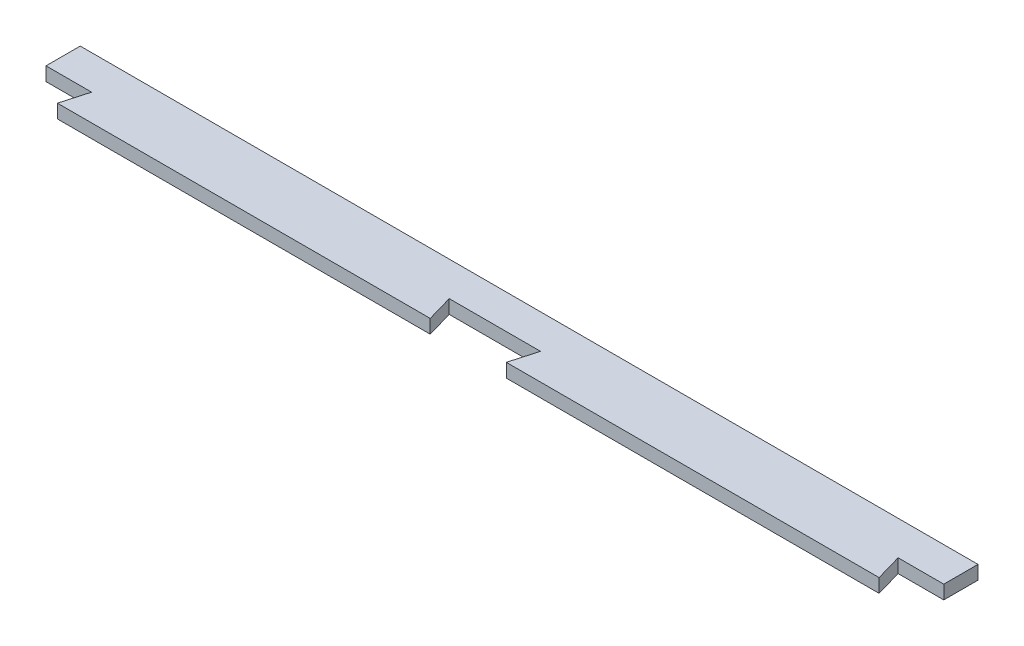
ISO-10303-21;
HEADER;
FILE_DESCRIPTION(('STEP AP214'),'2;1');
FILE_NAME('part.step','',(''),(''),'','','');
FILE_SCHEMA(('AUTOMOTIVE_DESIGN { 1 0 10303 214 1 1 1 1 }'));
ENDSEC;
DATA;
#1=APPLICATION_CONTEXT('core data for automotive mechanical design processes');
#2=APPLICATION_PROTOCOL_DEFINITION('international standard','automotive_design',2000,#1);
#3=PRODUCT_CONTEXT('',#1,'mechanical');
#4=PRODUCT('Part','Part','',(#3));
#5=PRODUCT_RELATED_PRODUCT_CATEGORY('part','',(#4));
#6=PRODUCT_DEFINITION_FORMATION('','',#4);
#7=PRODUCT_DEFINITION_CONTEXT('part definition',#1,'design');
#8=PRODUCT_DEFINITION('design','',#6,#7);
#9=PRODUCT_DEFINITION_SHAPE('','',#8);
#10=(LENGTH_UNIT() NAMED_UNIT(*) SI_UNIT(.MILLI.,.METRE.));
#11=(NAMED_UNIT(*) PLANE_ANGLE_UNIT() SI_UNIT($,.RADIAN.));
#12=(NAMED_UNIT(*) SI_UNIT($,.STERADIAN.) SOLID_ANGLE_UNIT());
#13=UNCERTAINTY_MEASURE_WITH_UNIT(LENGTH_MEASURE(1.E-05),#10,'distance_accuracy_value','');
#14=(GEOMETRIC_REPRESENTATION_CONTEXT(3) GLOBAL_UNCERTAINTY_ASSIGNED_CONTEXT((#13)) GLOBAL_UNIT_ASSIGNED_CONTEXT((#10,
#11,#12)) REPRESENTATION_CONTEXT('',''));
#15=CARTESIAN_POINT('',(0.,0.,0.));
#16=DIRECTION('',(0.,0.,1.));
#17=DIRECTION('',(1.,0.,0.));
#18=AXIS2_PLACEMENT_3D('',#15,#16,#17);
#19=CARTESIAN_POINT('',(0.,9.00000000000001,-17.5));
#20=DIRECTION('',(0.,0.,1.));
#21=DIRECTION('',(1.,0.,0.));
#22=AXIS2_PLACEMENT_3D('',#19,#20,#21);
#23=PLANE('',#22);
#24=DIRECTION('',(-1.,0.,0.));
#25=VECTOR('',#24,1.);
#26=CARTESIAN_POINT('',(0.,0.,-17.5));
#27=LINE('',#26,#25);
#28=CARTESIAN_POINT('',(590.,0.,-17.5000000000001));
#29=VERTEX_POINT('',#28);
#30=CARTESIAN_POINT('',(560.,0.,-17.5000000000001));
#31=VERTEX_POINT('',#30);
#32=EDGE_CURVE('E166',#29,#31,#27,.T.);
#33=ORIENTED_EDGE('',*,*,#32,.F.);
#34=DIRECTION('',(0.,-1.,0.));
#35=VECTOR('',#34,1.);
#36=CARTESIAN_POINT('',(590.,9.00000000000001,-17.5000000000001));
#37=LINE('',#36,#35);
#38=CARTESIAN_POINT('',(590.,9.00000000000001,-17.5000000000001));
#39=VERTEX_POINT('',#38);
#40=EDGE_CURVE('E11',#39,#29,#37,.T.);
#41=ORIENTED_EDGE('',*,*,#40,.F.);
#42=DIRECTION('',(-1.,0.,0.));
#43=VECTOR('',#42,1.);
#44=CARTESIAN_POINT('',(0.,9.00000000000001,-17.5));
#45=LINE('',#44,#43);
#46=CARTESIAN_POINT('',(560.,9.00000000000001,-17.5000000000001));
#47=VERTEX_POINT('',#46);
#48=EDGE_CURVE('E208',#39,#47,#45,.T.);
#49=ORIENTED_EDGE('',*,*,#48,.T.);
#50=DIRECTION('',(0.,-1.,0.));
#51=VECTOR('',#50,1.);
#52=CARTESIAN_POINT('',(560.,9.00000000000001,-17.5000000000001));
#53=LINE('',#52,#51);
#54=EDGE_CURVE('E59',#47,#31,#53,.T.);
#55=ORIENTED_EDGE('',*,*,#54,.T.);
#56=EDGE_LOOP('',(#33,#41,#49,#55));
#57=FACE_BOUND('',#56,.T.);
#58=ADVANCED_FACE('F42',(#57),#23,.T.);
#59=CARTESIAN_POINT('',(590.,9.00000000000001,0.));
#60=DIRECTION('',(-1.,0.,0.));
#61=DIRECTION('',(0.,0.,1.));
#62=AXIS2_PLACEMENT_3D('',#59,#60,#61);
#63=PLANE('',#62);
#64=DIRECTION('',(0.,0.,-1.));
#65=VECTOR('',#64,1.);
#66=CARTESIAN_POINT('',(590.,0.,0.));
#67=LINE('',#66,#65);
#68=CARTESIAN_POINT('',(590.,0.,-39.9999999999999));
#69=VERTEX_POINT('',#68);
#70=EDGE_CURVE('E169',#29,#69,#67,.T.);
#71=ORIENTED_EDGE('',*,*,#70,.T.);
#72=DIRECTION('',(0.,-1.,0.));
#73=VECTOR('',#72,1.);
#74=CARTESIAN_POINT('',(590.,9.00000000000001,-39.9999999999999));
#75=LINE('',#74,#73);
#76=CARTESIAN_POINT('',(590.,9.00000000000001,-39.9999999999999));
#77=VERTEX_POINT('',#76);
#78=EDGE_CURVE('E51',#77,#69,#75,.T.);
#79=ORIENTED_EDGE('',*,*,#78,.F.);
#80=DIRECTION('',(0.,0.,-1.));
#81=VECTOR('',#80,1.);
#82=CARTESIAN_POINT('',(590.,9.00000000000001,0.));
#83=LINE('',#82,#81);
#84=EDGE_CURVE('E257',#39,#77,#83,.T.);
#85=ORIENTED_EDGE('',*,*,#84,.F.);
#86=ORIENTED_EDGE('',*,*,#40,.T.);
#87=EDGE_LOOP('',(#71,#79,#85,#86));
#88=FACE_BOUND('',#87,.T.);
#89=ADVANCED_FACE('F245',(#88),#63,.F.);
#90=CARTESIAN_POINT('',(0.,9.00000000000001,-39.9999999999999));
#91=DIRECTION('',(0.,0.,-1.));
#92=DIRECTION('',(-1.,0.,0.));
#93=AXIS2_PLACEMENT_3D('',#90,#91,#92);
#94=PLANE('',#93);
#95=DIRECTION('',(1.,0.,0.));
#96=VECTOR('',#95,1.);
#97=CARTESIAN_POINT('',(0.,0.,-39.9999999999999));
#98=LINE('',#97,#96);
#99=CARTESIAN_POINT('',(0.,0.,-39.9999999999999));
#100=VERTEX_POINT('',#99);
#101=EDGE_CURVE('E173',#100,#69,#98,.T.);
#102=ORIENTED_EDGE('',*,*,#101,.F.);
#103=DIRECTION('',(0.,-1.,0.));
#104=VECTOR('',#103,1.);
#105=CARTESIAN_POINT('',(0.,9.00000000000001,-39.9999999999999));
#106=LINE('',#105,#104);
#107=CARTESIAN_POINT('',(0.,9.00000000000001,-39.9999999999999));
#108=VERTEX_POINT('',#107);
#109=EDGE_CURVE('E232',#108,#100,#106,.T.);
#110=ORIENTED_EDGE('',*,*,#109,.F.);
#111=DIRECTION('',(1.,0.,0.));
#112=VECTOR('',#111,1.);
#113=CARTESIAN_POINT('',(0.,9.00000000000001,-39.9999999999999));
#114=LINE('',#113,#112);
#115=EDGE_CURVE('E242',#108,#77,#114,.T.);
#116=ORIENTED_EDGE('',*,*,#115,.T.);
#117=ORIENTED_EDGE('',*,*,#78,.T.);
#118=EDGE_LOOP('',(#102,#110,#116,#117));
#119=FACE_BOUND('',#118,.T.);
#120=ADVANCED_FACE('F240',(#119),#94,.T.);
#121=CARTESIAN_POINT('',(0.,9.00000000000001,0.));
#122=DIRECTION('',(-1.,0.,0.));
#123=DIRECTION('',(0.,0.,1.));
#124=AXIS2_PLACEMENT_3D('',#121,#122,#123);
#125=PLANE('',#124);
#126=DIRECTION('',(0.,0.,-1.));
#127=VECTOR('',#126,1.);
#128=CARTESIAN_POINT('',(0.,0.,0.));
#129=LINE('',#128,#127);
#130=CARTESIAN_POINT('',(0.,0.,-17.5));
#131=VERTEX_POINT('',#130);
#132=EDGE_CURVE('E177',#131,#100,#129,.T.);
#133=ORIENTED_EDGE('',*,*,#132,.F.);
#134=DIRECTION('',(0.,-1.,0.));
#135=VECTOR('',#134,1.);
#136=CARTESIAN_POINT('',(0.,9.00000000000001,-17.5));
#137=LINE('',#136,#135);
#138=CARTESIAN_POINT('',(0.,9.00000000000001,-17.5));
#139=VERTEX_POINT('',#138);
#140=EDGE_CURVE('E229',#139,#131,#137,.T.);
#141=ORIENTED_EDGE('',*,*,#140,.F.);
#142=DIRECTION('',(0.,0.,-1.));
#143=VECTOR('',#142,1.);
#144=CARTESIAN_POINT('',(0.,9.00000000000001,0.));
#145=LINE('',#144,#143);
#146=EDGE_CURVE('E256',#139,#108,#145,.T.);
#147=ORIENTED_EDGE('',*,*,#146,.T.);
#148=ORIENTED_EDGE('',*,*,#109,.T.);
#149=EDGE_LOOP('',(#133,#141,#147,#148));
#150=FACE_BOUND('',#149,.T.);
#151=ADVANCED_FACE('F252',(#150),#125,.T.);
#152=CARTESIAN_POINT('',(0.,9.00000000000001,-17.5));
#153=DIRECTION('',(0.,0.,-1.));
#154=DIRECTION('',(-1.,0.,0.));
#155=AXIS2_PLACEMENT_3D('',#152,#153,#154);
#156=PLANE('',#155);
#157=DIRECTION('',(1.,0.,0.));
#158=VECTOR('',#157,1.);
#159=CARTESIAN_POINT('',(0.,0.,-17.5));
#160=LINE('',#159,#158);
#161=CARTESIAN_POINT('',(30.,0.,-17.5));
#162=VERTEX_POINT('',#161);
#163=EDGE_CURVE('E181',#131,#162,#160,.T.);
#164=ORIENTED_EDGE('',*,*,#163,.T.);
#165=DIRECTION('',(0.,-1.,0.));
#166=VECTOR('',#165,1.);
#167=CARTESIAN_POINT('',(30.,9.00000000000001,-17.5));
#168=LINE('',#167,#166);
#169=CARTESIAN_POINT('',(30.,9.00000000000001,-17.5));
#170=VERTEX_POINT('',#169);
#171=EDGE_CURVE('E225',#170,#162,#168,.T.);
#172=ORIENTED_EDGE('',*,*,#171,.F.);
#173=DIRECTION('',(1.,0.,0.));
#174=VECTOR('',#173,1.);
#175=CARTESIAN_POINT('',(0.,9.00000000000001,-17.5));
#176=LINE('',#175,#174);
#177=EDGE_CURVE('E263',#139,#170,#176,.T.);
#178=ORIENTED_EDGE('',*,*,#177,.F.);
#179=ORIENTED_EDGE('',*,*,#140,.T.);
#180=EDGE_LOOP('',(#164,#172,#178,#179));
#181=FACE_BOUND('',#180,.T.);
#182=ADVANCED_FACE('F306',(#181),#156,.F.);
#183=CARTESIAN_POINT('',(23.1132075471698,9.00000000000001,6.6037735849056));
#184=DIRECTION('',(0.961523947640823,0.,0.274721127897378));
#185=DIRECTION('',(0.274721127897378,0.,-0.961523947640823));
#186=AXIS2_PLACEMENT_3D('',#183,#184,#185);
#187=PLANE('',#186);
#188=DIRECTION('',(-0.274721127897378,0.,0.961523947640823));
#189=VECTOR('',#188,1.);
#190=CARTESIAN_POINT('',(23.1132075471698,0.,6.6037735849056));
#191=LINE('',#190,#189);
#192=CARTESIAN_POINT('',(25.,0.,0.));
#193=VERTEX_POINT('',#192);
#194=EDGE_CURVE('E184',#162,#193,#191,.T.);
#195=ORIENTED_EDGE('',*,*,#194,.T.);
#196=DIRECTION('',(0.,-1.,0.));
#197=VECTOR('',#196,1.);
#198=CARTESIAN_POINT('',(25.,9.00000000000001,0.));
#199=LINE('',#198,#197);
#200=CARTESIAN_POINT('',(25.,9.00000000000001,0.));
#201=VERTEX_POINT('',#200);
#202=EDGE_CURVE('E221',#201,#193,#199,.T.);
#203=ORIENTED_EDGE('',*,*,#202,.F.);
#204=DIRECTION('',(-0.274721127897378,0.,0.961523947640823));
#205=VECTOR('',#204,1.);
#206=CARTESIAN_POINT('',(23.1132075471698,9.00000000000001,6.6037735849056));
#207=LINE('',#206,#205);
#208=EDGE_CURVE('E270',#170,#201,#207,.T.);
#209=ORIENTED_EDGE('',*,*,#208,.F.);
#210=ORIENTED_EDGE('',*,*,#171,.T.);
#211=EDGE_LOOP('',(#195,#203,#209,#210));
#212=FACE_BOUND('',#211,.T.);
#213=ADVANCED_FACE('F309',(#212),#187,.F.);
#214=CARTESIAN_POINT('',(0.,9.00000000000001,0.));
#215=DIRECTION('',(0.,0.,-1.));
#216=DIRECTION('',(-1.,0.,0.));
#217=AXIS2_PLACEMENT_3D('',#214,#215,#216);
#218=PLANE('',#217);
#219=DIRECTION('',(1.,0.,0.));
#220=VECTOR('',#219,1.);
#221=CARTESIAN_POINT('',(0.,0.,0.));
#222=LINE('',#221,#220);
#223=CARTESIAN_POINT('',(270.,0.,0.));
#224=VERTEX_POINT('',#223);
#225=EDGE_CURVE('E187',#193,#224,#222,.T.);
#226=ORIENTED_EDGE('',*,*,#225,.T.);
#227=DIRECTION('',(0.,-1.,0.));
#228=VECTOR('',#227,1.);
#229=CARTESIAN_POINT('',(270.,9.00000000000001,0.));
#230=LINE('',#229,#228);
#231=CARTESIAN_POINT('',(270.,9.00000000000001,0.));
#232=VERTEX_POINT('',#231);
#233=EDGE_CURVE('E218',#232,#224,#230,.T.);
#234=ORIENTED_EDGE('',*,*,#233,.F.);
#235=DIRECTION('',(1.,0.,0.));
#236=VECTOR('',#235,1.);
#237=CARTESIAN_POINT('',(0.,9.00000000000001,0.));
#238=LINE('',#237,#236);
#239=EDGE_CURVE('E273',#201,#232,#238,.T.);
#240=ORIENTED_EDGE('',*,*,#239,.F.);
#241=ORIENTED_EDGE('',*,*,#202,.T.);
#242=EDGE_LOOP('',(#226,#234,#240,#241));
#243=FACE_BOUND('',#242,.T.);
#244=ADVANCED_FACE('F313',(#243),#218,.F.);
#245=CARTESIAN_POINT('',(249.622641509434,9.00000000000001,-71.3207547169805));
#246=DIRECTION('',(0.961523947640824,0.,-0.274721127897376));
#247=DIRECTION('',(-0.274721127897376,0.,-0.961523947640824));
#248=AXIS2_PLACEMENT_3D('',#245,#246,#247);
#249=PLANE('',#248);
#250=DIRECTION('',(0.274721127897376,0.,0.961523947640824));
#251=VECTOR('',#250,1.);
#252=CARTESIAN_POINT('',(249.622641509434,0.,-71.3207547169805));
#253=LINE('',#252,#251);
#254=CARTESIAN_POINT('',(265.,0.,-17.5));
#255=VERTEX_POINT('',#254);
#256=EDGE_CURVE('E191',#255,#224,#253,.T.);
#257=ORIENTED_EDGE('',*,*,#256,.F.);
#258=DIRECTION('',(0.,-1.,0.));
#259=VECTOR('',#258,1.);
#260=CARTESIAN_POINT('',(265.,9.00000000000001,-17.5));
#261=LINE('',#260,#259);
#262=CARTESIAN_POINT('',(265.,9.00000000000001,-17.5));
#263=VERTEX_POINT('',#262);
#264=EDGE_CURVE('E215',#263,#255,#261,.T.);
#265=ORIENTED_EDGE('',*,*,#264,.F.);
#266=DIRECTION('',(0.274721127897376,0.,0.961523947640824));
#267=VECTOR('',#266,1.);
#268=CARTESIAN_POINT('',(249.622641509434,9.00000000000001,-71.3207547169805));
#269=LINE('',#268,#267);
#270=EDGE_CURVE('E276',#263,#232,#269,.T.);
#271=ORIENTED_EDGE('',*,*,#270,.T.);
#272=ORIENTED_EDGE('',*,*,#233,.T.);
#273=EDGE_LOOP('',(#257,#265,#271,#272));
#274=FACE_BOUND('',#273,.T.);
#275=ADVANCED_FACE('F317',(#274),#249,.T.);
#276=CARTESIAN_POINT('',(0.,9.00000000000001,-17.5));
#277=DIRECTION('',(0.,0.,1.));
#278=DIRECTION('',(1.,0.,0.));
#279=AXIS2_PLACEMENT_3D('',#276,#277,#278);
#280=PLANE('',#279);
#281=DIRECTION('',(-1.,0.,0.));
#282=VECTOR('',#281,1.);
#283=CARTESIAN_POINT('',(0.,0.,-17.5));
#284=LINE('',#283,#282);
#285=CARTESIAN_POINT('',(325.,0.,-17.5));
#286=VERTEX_POINT('',#285);
#287=EDGE_CURVE('E195',#286,#255,#284,.T.);
#288=ORIENTED_EDGE('',*,*,#287,.F.);
#289=DIRECTION('',(0.,-1.,0.));
#290=VECTOR('',#289,1.);
#291=CARTESIAN_POINT('',(325.,9.00000000000001,-17.5));
#292=LINE('',#291,#290);
#293=CARTESIAN_POINT('',(325.,9.00000000000001,-17.5));
#294=VERTEX_POINT('',#293);
#295=EDGE_CURVE('E155',#294,#286,#292,.T.);
#296=ORIENTED_EDGE('',*,*,#295,.F.);
#297=DIRECTION('',(-1.,0.,0.));
#298=VECTOR('',#297,1.);
#299=CARTESIAN_POINT('',(0.,9.00000000000001,-17.5));
#300=LINE('',#299,#298);
#301=EDGE_CURVE('E143',#294,#263,#300,.T.);
#302=ORIENTED_EDGE('',*,*,#301,.T.);
#303=ORIENTED_EDGE('',*,*,#264,.T.);
#304=EDGE_LOOP('',(#288,#296,#302,#303));
#305=FACE_BOUND('',#304,.T.);
#306=ADVANCED_FACE('F283',(#305),#280,.T.);
#307=CARTESIAN_POINT('',(295.849056603774,9.00000000000001,84.5283018867917));
#308=DIRECTION('',(0.961523947640824,0.,0.274721127897376));
#309=DIRECTION('',(0.274721127897376,0.,-0.961523947640824));
#310=AXIS2_PLACEMENT_3D('',#307,#308,#309);
#311=PLANE('',#310);
#312=DIRECTION('',(-0.274721127897376,0.,0.961523947640824));
#313=VECTOR('',#312,1.);
#314=CARTESIAN_POINT('',(295.849056603774,0.,84.5283018867917));
#315=LINE('',#314,#313);
#316=CARTESIAN_POINT('',(320.,0.,0.));
#317=VERTEX_POINT('',#316);
#318=EDGE_CURVE('E151',#286,#317,#315,.T.);
#319=ORIENTED_EDGE('',*,*,#318,.T.);
#320=DIRECTION('',(0.,-1.,0.));
#321=VECTOR('',#320,1.);
#322=CARTESIAN_POINT('',(320.,9.00000000000001,0.));
#323=LINE('',#322,#321);
#324=CARTESIAN_POINT('',(320.,9.00000000000001,0.));
#325=VERTEX_POINT('',#324);
#326=EDGE_CURVE('E148',#325,#317,#323,.T.);
#327=ORIENTED_EDGE('',*,*,#326,.F.);
#328=DIRECTION('',(-0.274721127897376,0.,0.961523947640824));
#329=VECTOR('',#328,1.);
#330=CARTESIAN_POINT('',(295.849056603774,9.00000000000001,84.5283018867917));
#331=LINE('',#330,#329);
#332=EDGE_CURVE('E134',#294,#325,#331,.T.);
#333=ORIENTED_EDGE('',*,*,#332,.F.);
#334=ORIENTED_EDGE('',*,*,#295,.T.);
#335=EDGE_LOOP('',(#319,#327,#333,#334));
#336=FACE_BOUND('',#335,.T.);
#337=ADVANCED_FACE('F149',(#336),#311,.F.);
#338=CARTESIAN_POINT('',(0.,9.00000000000001,0.));
#339=DIRECTION('',(0.,0.,-1.));
#340=DIRECTION('',(-1.,0.,0.));
#341=AXIS2_PLACEMENT_3D('',#338,#339,#340);
#342=PLANE('',#341);
#343=DIRECTION('',(1.,0.,0.));
#344=VECTOR('',#343,1.);
#345=CARTESIAN_POINT('',(0.,0.,0.));
#346=LINE('',#345,#344);
#347=CARTESIAN_POINT('',(565.,0.,0.));
#348=VERTEX_POINT('',#347);
#349=EDGE_CURVE('E201',#317,#348,#346,.T.);
#350=ORIENTED_EDGE('',*,*,#349,.T.);
#351=DIRECTION('',(0.,-1.,0.));
#352=VECTOR('',#351,1.);
#353=CARTESIAN_POINT('',(565.,9.00000000000001,0.));
#354=LINE('',#353,#352);
#355=CARTESIAN_POINT('',(565.,9.00000000000001,0.));
#356=VERTEX_POINT('',#355);
#357=EDGE_CURVE('E97',#356,#348,#354,.T.);
#358=ORIENTED_EDGE('',*,*,#357,.F.);
#359=DIRECTION('',(1.,0.,0.));
#360=VECTOR('',#359,1.);
#361=CARTESIAN_POINT('',(0.,9.00000000000001,0.));
#362=LINE('',#361,#360);
#363=EDGE_CURVE('E140',#325,#356,#362,.T.);
#364=ORIENTED_EDGE('',*,*,#363,.F.);
#365=ORIENTED_EDGE('',*,*,#326,.T.);
#366=EDGE_LOOP('',(#350,#358,#364,#365));
#367=FACE_BOUND('',#366,.T.);
#368=ADVANCED_FACE('F157',(#367),#342,.F.);
#369=CARTESIAN_POINT('',(522.358490566039,9.00000000000001,-149.245283018865));
#370=DIRECTION('',(0.961523947640825,0.,-0.274721127897373));
#371=DIRECTION('',(-0.274721127897373,0.,-0.961523947640825));
#372=AXIS2_PLACEMENT_3D('',#369,#370,#371);
#373=PLANE('',#372);
#374=DIRECTION('',(0.274721127897373,0.,0.961523947640825));
#375=VECTOR('',#374,1.);
#376=CARTESIAN_POINT('',(522.358490566039,0.,-149.245283018865));
#377=LINE('',#376,#375);
#378=EDGE_CURVE('E204',#31,#348,#377,.T.);
#379=ORIENTED_EDGE('',*,*,#378,.F.);
#380=ORIENTED_EDGE('',*,*,#54,.F.);
#381=DIRECTION('',(0.274721127897373,0.,0.961523947640825));
#382=VECTOR('',#381,1.);
#383=CARTESIAN_POINT('',(522.358490566039,9.00000000000001,-149.245283018865));
#384=LINE('',#383,#382);
#385=EDGE_CURVE('E159',#47,#356,#384,.T.);
#386=ORIENTED_EDGE('',*,*,#385,.T.);
#387=ORIENTED_EDGE('',*,*,#357,.T.);
#388=EDGE_LOOP('',(#379,#380,#386,#387));
#389=FACE_BOUND('',#388,.T.);
#390=ADVANCED_FACE('F285',(#389),#373,.T.);
#391=CARTESIAN_POINT('',(0.,9.00000000000001,0.));
#392=DIRECTION('',(0.,1.,0.));
#393=DIRECTION('',(0.,0.,1.));
#394=AXIS2_PLACEMENT_3D('',#391,#392,#393);
#395=PLANE('',#394);
#396=ORIENTED_EDGE('',*,*,#48,.F.);
#397=ORIENTED_EDGE('',*,*,#84,.T.);
#398=ORIENTED_EDGE('',*,*,#115,.F.);
#399=ORIENTED_EDGE('',*,*,#146,.F.);
#400=ORIENTED_EDGE('',*,*,#177,.T.);
#401=ORIENTED_EDGE('',*,*,#208,.T.);
#402=ORIENTED_EDGE('',*,*,#239,.T.);
#403=ORIENTED_EDGE('',*,*,#270,.F.);
#404=ORIENTED_EDGE('',*,*,#301,.F.);
#405=ORIENTED_EDGE('',*,*,#332,.T.);
#406=ORIENTED_EDGE('',*,*,#363,.T.);
#407=ORIENTED_EDGE('',*,*,#385,.F.);
#408=EDGE_LOOP('',(#396,#397,#398,#399,#400,#401,#402,#403,#404,#405,#406,#407));
#409=FACE_BOUND('',#408,.T.);
#410=ADVANCED_FACE('F137',(#409),#395,.T.);
#411=CARTESIAN_POINT('',(0.,0.,0.));
#412=DIRECTION('',(0.,1.,0.));
#413=DIRECTION('',(0.,0.,1.));
#414=AXIS2_PLACEMENT_3D('',#411,#412,#413);
#415=PLANE('',#414);
#416=ORIENTED_EDGE('',*,*,#32,.T.);
#417=ORIENTED_EDGE('',*,*,#378,.T.);
#418=ORIENTED_EDGE('',*,*,#349,.F.);
#419=ORIENTED_EDGE('',*,*,#318,.F.);
#420=ORIENTED_EDGE('',*,*,#287,.T.);
#421=ORIENTED_EDGE('',*,*,#256,.T.);
#422=ORIENTED_EDGE('',*,*,#225,.F.);
#423=ORIENTED_EDGE('',*,*,#194,.F.);
#424=ORIENTED_EDGE('',*,*,#163,.F.);
#425=ORIENTED_EDGE('',*,*,#132,.T.);
#426=ORIENTED_EDGE('',*,*,#101,.T.);
#427=ORIENTED_EDGE('',*,*,#70,.F.);
#428=EDGE_LOOP('',(#416,#417,#418,#419,#420,#421,#422,#423,#424,#425,#426,#427));
#429=FACE_BOUND('',#428,.T.);
#430=ADVANCED_FACE('F247',(#429),#415,.F.);
#431=CLOSED_SHELL('',(#58,#89,#120,#151,#182,#213,#244,#275,#306,#337,#368,#390,#410,#430));
#432=MANIFOLD_SOLID_BREP('B2',#431);
#433=ADVANCED_BREP_SHAPE_REPRESENTATION('',(#18,#432),#14);
#434=SHAPE_DEFINITION_REPRESENTATION(#9,#433);
ENDSEC;
END-ISO-10303-21;
